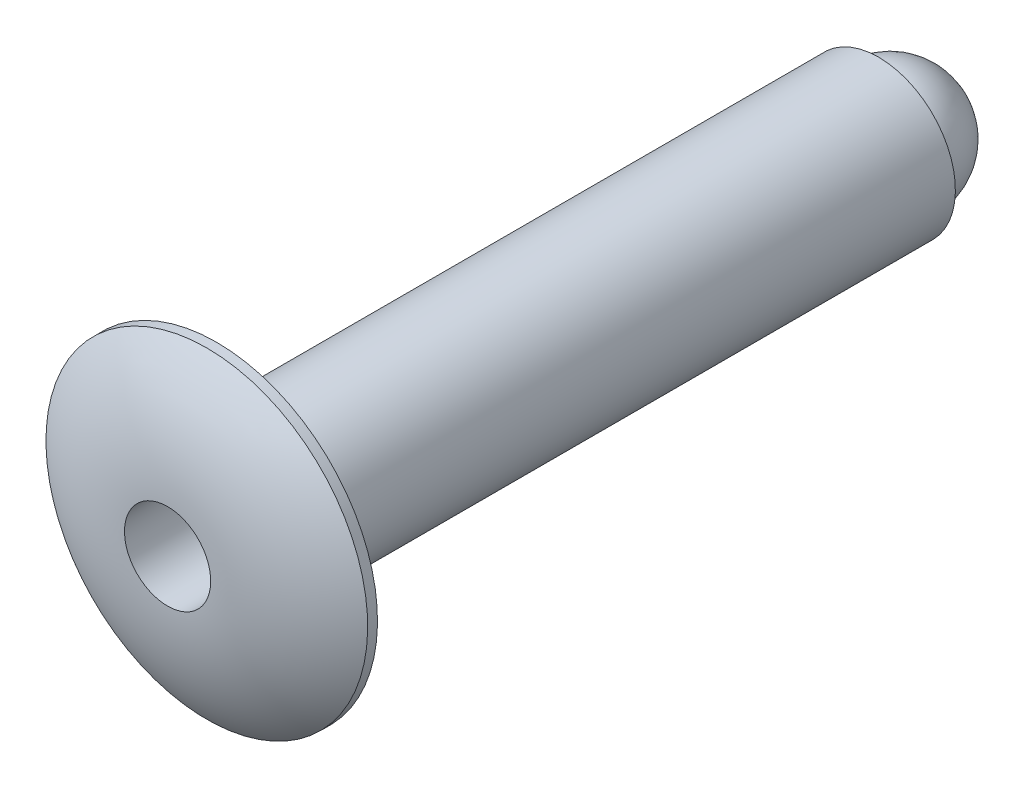
ISO-10303-21;
HEADER;
FILE_DESCRIPTION(('STEP AP214'),'2;1');
FILE_NAME('part.step','',(''),(''),'','','');
FILE_SCHEMA(('AUTOMOTIVE_DESIGN { 1 0 10303 214 1 1 1 1 }'));
ENDSEC;
DATA;
#1=APPLICATION_CONTEXT('core data for automotive mechanical design processes');
#2=APPLICATION_PROTOCOL_DEFINITION('international standard','automotive_design',2000,#1);
#3=PRODUCT_CONTEXT('',#1,'mechanical');
#4=PRODUCT('Part','Part','',(#3));
#5=PRODUCT_RELATED_PRODUCT_CATEGORY('part','',(#4));
#6=PRODUCT_DEFINITION_FORMATION('','',#4);
#7=PRODUCT_DEFINITION_CONTEXT('part definition',#1,'design');
#8=PRODUCT_DEFINITION('design','',#6,#7);
#9=PRODUCT_DEFINITION_SHAPE('','',#8);
#10=(LENGTH_UNIT() NAMED_UNIT(*) SI_UNIT(.MILLI.,.METRE.));
#11=(NAMED_UNIT(*) PLANE_ANGLE_UNIT() SI_UNIT($,.RADIAN.));
#12=(NAMED_UNIT(*) SI_UNIT($,.STERADIAN.) SOLID_ANGLE_UNIT());
#13=UNCERTAINTY_MEASURE_WITH_UNIT(LENGTH_MEASURE(1.E-05),#10,'distance_accuracy_value','');
#14=(GEOMETRIC_REPRESENTATION_CONTEXT(3) GLOBAL_UNCERTAINTY_ASSIGNED_CONTEXT((#13)) GLOBAL_UNIT_ASSIGNED_CONTEXT((#10,
#11,#12)) REPRESENTATION_CONTEXT('',''));
#15=CARTESIAN_POINT('',(0.,0.,0.));
#16=DIRECTION('',(0.,0.,1.));
#17=DIRECTION('',(1.,0.,0.));
#18=AXIS2_PLACEMENT_3D('',#15,#16,#17);
#19=CARTESIAN_POINT('',(0.,0.,-17.4360416666667));
#20=DIRECTION('',(0.,0.,1.));
#21=DIRECTION('',(0.,1.,0.));
#22=AXIS2_PLACEMENT_3D('',#19,#20,#21);
#23=SPHERICAL_SURFACE('',#22,1.61395833333333);
#24=CARTESIAN_POINT('',(0.,0.,-17.145));
#25=DIRECTION('',(0.,0.,1.));
#26=DIRECTION('',(1.,0.,0.));
#27=AXIS2_PLACEMENT_3D('',#24,#25,#26);
#28=CIRCLE('',#27,1.5875);
#29=CARTESIAN_POINT('',(1.5875,0.,-17.145));
#30=VERTEX_POINT('',#29);
#31=EDGE_CURVE('E11',#30,#30,#28,.T.);
#32=ORIENTED_EDGE('',*,*,#31,.F.);
#33=EDGE_LOOP('',(#32));
#34=FACE_BOUND('',#33,.T.);
#35=ADVANCED_FACE('F47',(#34),#23,.T.);
#36=CARTESIAN_POINT('',(0.,1.5875,-17.145));
#37=DIRECTION('',(0.,0.,-1.));
#38=DIRECTION('',(-1.,0.,0.));
#39=AXIS2_PLACEMENT_3D('',#36,#37,#38);
#40=PLANE('',#39);
#41=ORIENTED_EDGE('',*,*,#31,.T.);
#42=EDGE_LOOP('',(#41));
#43=FACE_BOUND('',#42,.T.);
#44=ADVANCED_FACE('F54',(#43),#40,.F.);
#45=CLOSED_SHELL('',(#35,#44));
#46=MANIFOLD_SOLID_BREP('B2',#45);
#47=CARTESIAN_POINT('',(0.,0.,-17.145));
#48=DIRECTION('',(0.,0.,-1.));
#49=DIRECTION('',(0.,1.,0.));
#50=AXIS2_PLACEMENT_3D('',#47,#48,#49);
#51=CYLINDRICAL_SURFACE('',#50,4.1656);
#52=CARTESIAN_POINT('',(0.,0.,0.254000000000001));
#53=DIRECTION('',(0.,0.,-1.));
#54=DIRECTION('',(0.,1.,0.));
#55=AXIS2_PLACEMENT_3D('',#52,#53,#54);
#56=CIRCLE('',#55,4.1656);
#57=CARTESIAN_POINT('',(0.,4.1656,0.254000000000001));
#58=VERTEX_POINT('',#57);
#59=EDGE_CURVE('E86',#58,#58,#56,.T.);
#60=ORIENTED_EDGE('',*,*,#59,.T.);
#61=EDGE_LOOP('',(#60));
#62=FACE_BOUND('',#61,.T.);
#63=CARTESIAN_POINT('',(0.,0.,0.));
#64=DIRECTION('',(0.,0.,-1.));
#65=DIRECTION('',(0.,1.,0.));
#66=AXIS2_PLACEMENT_3D('',#63,#64,#65);
#67=CIRCLE('',#66,4.1656);
#68=CARTESIAN_POINT('',(0.,4.1656,0.));
#69=VERTEX_POINT('',#68);
#70=EDGE_CURVE('E105',#69,#69,#67,.T.);
#71=ORIENTED_EDGE('',*,*,#70,.F.);
#72=EDGE_LOOP('',(#71));
#73=FACE_BOUND('',#72,.T.);
#74=ADVANCED_FACE('F73',(#62,#73),#51,.T.);
#75=CARTESIAN_POINT('',(0.,0.,-3.81416813705444));
#76=DIRECTION('',(0.,0.,-1.));
#77=DIRECTION('',(0.,1.,0.));
#78=AXIS2_PLACEMENT_3D('',#75,#76,#77);
#79=DEGENERATE_TOROIDAL_SURFACE('',#78,1.1162109375,5.08416813705444,.T.);
#80=CARTESIAN_POINT('',(0.,0.,1.27));
#81=DIRECTION('',(0.,0.,-1.));
#82=DIRECTION('',(0.,1.,0.));
#83=AXIS2_PLACEMENT_3D('',#80,#81,#82);
#84=CIRCLE('',#83,1.1162109375);
#85=CARTESIAN_POINT('',(0.,1.1162109375,1.27));
#86=VERTEX_POINT('',#85);
#87=EDGE_CURVE('E91',#86,#86,#84,.T.);
#88=ORIENTED_EDGE('',*,*,#87,.T.);
#89=EDGE_LOOP('',(#88));
#90=FACE_BOUND('',#89,.T.);
#91=ORIENTED_EDGE('',*,*,#59,.F.);
#92=EDGE_LOOP('',(#91));
#93=FACE_BOUND('',#92,.T.);
#94=ADVANCED_FACE('F113',(#90,#93),#79,.T.);
#95=CARTESIAN_POINT('',(0.,0.,-17.145));
#96=DIRECTION('',(0.,0.,-1.));
#97=DIRECTION('',(0.,1.,0.));
#98=AXIS2_PLACEMENT_3D('',#95,#96,#97);
#99=CYLINDRICAL_SURFACE('',#98,1.1162109375);
#100=CARTESIAN_POINT('',(0.,0.,-1.7145));
#101=DIRECTION('',(0.,0.,-1.));
#102=DIRECTION('',(0.,1.,0.));
#103=AXIS2_PLACEMENT_3D('',#100,#101,#102);
#104=CIRCLE('',#103,1.1162109375);
#105=CARTESIAN_POINT('',(0.,1.1162109375,-1.7145));
#106=VERTEX_POINT('',#105);
#107=EDGE_CURVE('E97',#106,#106,#104,.T.);
#108=ORIENTED_EDGE('',*,*,#107,.T.);
#109=EDGE_LOOP('',(#108));
#110=FACE_BOUND('',#109,.T.);
#111=ORIENTED_EDGE('',*,*,#87,.F.);
#112=EDGE_LOOP('',(#111));
#113=FACE_BOUND('',#112,.T.);
#114=ADVANCED_FACE('F118',(#110,#113),#99,.F.);
#115=CARTESIAN_POINT('',(0.,1.1162109375,-1.7145));
#116=DIRECTION('',(0.,0.,1.));
#117=DIRECTION('',(0.,-1.,0.));
#118=AXIS2_PLACEMENT_3D('',#115,#116,#117);
#119=PLANE('',#118);
#120=ORIENTED_EDGE('',*,*,#107,.F.);
#121=EDGE_LOOP('',(#120));
#122=FACE_BOUND('',#121,.T.);
#123=ADVANCED_FACE('F124',(#122),#119,.T.);
#124=CARTESIAN_POINT('',(0.,1.984375,-17.145));
#125=DIRECTION('',(0.,0.,-1.));
#126=DIRECTION('',(0.,1.,0.));
#127=AXIS2_PLACEMENT_3D('',#124,#125,#126);
#128=PLANE('',#127);
#129=CARTESIAN_POINT('',(0.,0.,-17.145));
#130=DIRECTION('',(0.,0.,-1.));
#131=DIRECTION('',(0.,1.,0.));
#132=AXIS2_PLACEMENT_3D('',#129,#130,#131);
#133=CIRCLE('',#132,1.984375);
#134=CARTESIAN_POINT('',(0.,1.984375,-17.145));
#135=VERTEX_POINT('',#134);
#136=EDGE_CURVE('E101',#135,#135,#133,.T.);
#137=ORIENTED_EDGE('',*,*,#136,.T.);
#138=EDGE_LOOP('',(#137));
#139=FACE_BOUND('',#138,.T.);
#140=ADVANCED_FACE('F128',(#139),#128,.T.);
#141=CARTESIAN_POINT('',(0.,0.,-17.145));
#142=DIRECTION('',(0.,0.,-1.));
#143=DIRECTION('',(0.,1.,0.));
#144=AXIS2_PLACEMENT_3D('',#141,#142,#143);
#145=CYLINDRICAL_SURFACE('',#144,1.984375);
#146=CARTESIAN_POINT('',(0.,0.,-0.254000000000001));
#147=DIRECTION('',(0.,0.,-1.));
#148=DIRECTION('',(0.,1.,0.));
#149=AXIS2_PLACEMENT_3D('',#146,#147,#148);
#150=CIRCLE('',#149,1.984375);
#151=CARTESIAN_POINT('',(0.,1.984375,-0.254000000000001));
#152=VERTEX_POINT('',#151);
#153=EDGE_CURVE('E81',#152,#152,#150,.T.);
#154=ORIENTED_EDGE('',*,*,#153,.T.);
#155=EDGE_LOOP('',(#154));
#156=FACE_BOUND('',#155,.T.);
#157=ORIENTED_EDGE('',*,*,#136,.F.);
#158=EDGE_LOOP('',(#157));
#159=FACE_BOUND('',#158,.T.);
#160=ADVANCED_FACE('F132',(#156,#159),#145,.T.);
#161=CARTESIAN_POINT('',(0.,1.984375,0.));
#162=DIRECTION('',(0.,0.,-1.));
#163=DIRECTION('',(0.,1.,0.));
#164=AXIS2_PLACEMENT_3D('',#161,#162,#163);
#165=PLANE('',#164);
#166=CARTESIAN_POINT('',(0.,0.,0.));
#167=DIRECTION('',(0.,0.,-1.));
#168=DIRECTION('',(0.,1.,0.));
#169=AXIS2_PLACEMENT_3D('',#166,#167,#168);
#170=CIRCLE('',#169,2.238375);
#171=CARTESIAN_POINT('',(0.,2.238375,0.));
#172=VERTEX_POINT('',#171);
#173=EDGE_CURVE('E46',#172,#172,#170,.F.);
#174=ORIENTED_EDGE('',*,*,#173,.T.);
#175=EDGE_LOOP('',(#174));
#176=FACE_BOUND('',#175,.T.);
#177=ORIENTED_EDGE('',*,*,#70,.T.);
#178=EDGE_LOOP('',(#177));
#179=FACE_BOUND('',#178,.T.);
#180=ADVANCED_FACE('F110',(#176,#179),#165,.T.);
#181=CARTESIAN_POINT('',(0.,0.,-0.254000000000001));
#182=DIRECTION('',(0.,0.,-1.));
#183=DIRECTION('',(0.,1.,0.));
#184=AXIS2_PLACEMENT_3D('',#181,#182,#183);
#185=TOROIDAL_SURFACE('',#184,2.238375,0.254);
#186=ORIENTED_EDGE('',*,*,#173,.F.);
#187=EDGE_LOOP('',(#186));
#188=FACE_BOUND('',#187,.T.);
#189=ORIENTED_EDGE('',*,*,#153,.F.);
#190=EDGE_LOOP('',(#189));
#191=FACE_BOUND('',#190,.T.);
#192=ADVANCED_FACE('F75',(#188,#191),#185,.F.);
#193=CLOSED_SHELL('',(#74,#94,#114,#123,#140,#160,#180,#192));
#194=MANIFOLD_SOLID_BREP('B6',#193);
#195=ADVANCED_BREP_SHAPE_REPRESENTATION('',(#18,#46,#194),#14);
#196=SHAPE_DEFINITION_REPRESENTATION(#9,#195);
ENDSEC;
END-ISO-10303-21;
